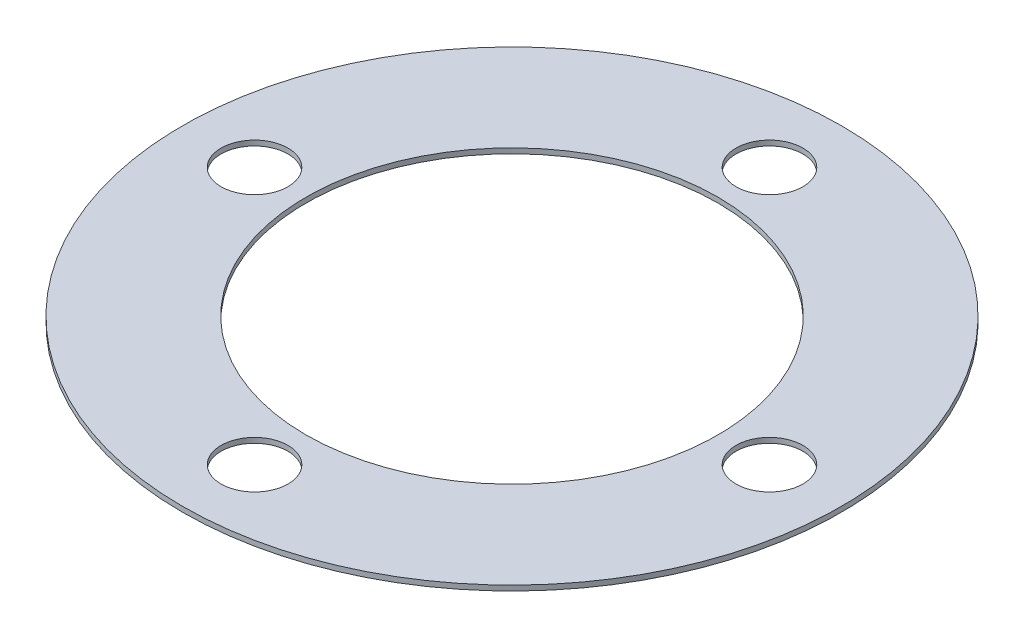
ISO-10303-21;
HEADER;
FILE_DESCRIPTION(('STEP AP214'),'2;1');
FILE_NAME('part.step','',(''),(''),'','','');
FILE_SCHEMA(('AUTOMOTIVE_DESIGN { 1 0 10303 214 1 1 1 1 }'));
ENDSEC;
DATA;
#1=APPLICATION_CONTEXT('core data for automotive mechanical design processes');
#2=APPLICATION_PROTOCOL_DEFINITION('international standard','automotive_design',2000,#1);
#3=PRODUCT_CONTEXT('',#1,'mechanical');
#4=PRODUCT('Part','Part','',(#3));
#5=PRODUCT_RELATED_PRODUCT_CATEGORY('part','',(#4));
#6=PRODUCT_DEFINITION_FORMATION('','',#4);
#7=PRODUCT_DEFINITION_CONTEXT('part definition',#1,'design');
#8=PRODUCT_DEFINITION('design','',#6,#7);
#9=PRODUCT_DEFINITION_SHAPE('','',#8);
#10=(LENGTH_UNIT() NAMED_UNIT(*) SI_UNIT(.MILLI.,.METRE.));
#11=(NAMED_UNIT(*) PLANE_ANGLE_UNIT() SI_UNIT($,.RADIAN.));
#12=(NAMED_UNIT(*) SI_UNIT($,.STERADIAN.) SOLID_ANGLE_UNIT());
#13=UNCERTAINTY_MEASURE_WITH_UNIT(LENGTH_MEASURE(1.E-05),#10,'distance_accuracy_value','');
#14=(GEOMETRIC_REPRESENTATION_CONTEXT(3) GLOBAL_UNCERTAINTY_ASSIGNED_CONTEXT((#13)) GLOBAL_UNIT_ASSIGNED_CONTEXT((#10,
#11,#12)) REPRESENTATION_CONTEXT('',''));
#15=CARTESIAN_POINT('',(0.,0.,0.));
#16=DIRECTION('',(0.,0.,1.));
#17=DIRECTION('',(1.,0.,0.));
#18=AXIS2_PLACEMENT_3D('',#15,#16,#17);
#19=CARTESIAN_POINT('',(0.,0.5,0.));
#20=DIRECTION('',(0.,1.,0.));
#21=DIRECTION('',(0.,0.,1.));
#22=AXIS2_PLACEMENT_3D('',#19,#20,#21);
#23=PLANE('',#22);
#24=CARTESIAN_POINT('',(2.8329860920468E-12,0.5,25.));
#25=DIRECTION('',(0.,1.,0.));
#26=DIRECTION('',(0.,0.,1.));
#27=AXIS2_PLACEMENT_3D('',#24,#25,#26);
#28=CIRCLE('',#27,3.25000000000288);
#29=CARTESIAN_POINT('',(2.8329860920468E-12,0.5,28.2500000000029));
#30=VERTEX_POINT('',#29);
#31=EDGE_CURVE('E59',#30,#30,#28,.T.);
#32=ORIENTED_EDGE('',*,*,#31,.F.);
#33=EDGE_LOOP('',(#32));
#34=FACE_BOUND('',#33,.T.);
#35=CARTESIAN_POINT('',(0.,0.5,-25.));
#36=DIRECTION('',(0.,1.,0.));
#37=DIRECTION('',(0.,0.,1.));
#38=AXIS2_PLACEMENT_3D('',#35,#36,#37);
#39=CIRCLE('',#38,3.25);
#40=CARTESIAN_POINT('',(0.,0.5,-21.75));
#41=VERTEX_POINT('',#40);
#42=EDGE_CURVE('E47',#41,#41,#39,.T.);
#43=ORIENTED_EDGE('',*,*,#42,.F.);
#44=EDGE_LOOP('',(#43));
#45=FACE_BOUND('',#44,.T.);
#46=CARTESIAN_POINT('',(0.,0.5,0.));
#47=DIRECTION('',(0.,1.,0.));
#48=DIRECTION('',(0.,0.,1.));
#49=AXIS2_PLACEMENT_3D('',#46,#47,#48);
#50=CIRCLE('',#49,32.);
#51=CARTESIAN_POINT('',(0.,0.5,32.));
#52=VERTEX_POINT('',#51);
#53=EDGE_CURVE('E10',#52,#52,#50,.T.);
#54=ORIENTED_EDGE('',*,*,#53,.T.);
#55=EDGE_LOOP('',(#54));
#56=FACE_BOUND('',#55,.T.);
#57=CARTESIAN_POINT('',(0.,0.5,0.));
#58=DIRECTION('',(0.,1.,0.));
#59=DIRECTION('',(0.,0.,1.));
#60=AXIS2_PLACEMENT_3D('',#57,#58,#59);
#61=CIRCLE('',#60,20.);
#62=CARTESIAN_POINT('',(0.,0.5,20.));
#63=VERTEX_POINT('',#62);
#64=EDGE_CURVE('E42',#63,#63,#61,.T.);
#65=ORIENTED_EDGE('',*,*,#64,.F.);
#66=EDGE_LOOP('',(#65));
#67=FACE_BOUND('',#66,.T.);
#68=CARTESIAN_POINT('',(25.0000000000014,0.5,-1.4164930460234E-12));
#69=DIRECTION('',(0.,1.,0.));
#70=DIRECTION('',(0.,0.,1.));
#71=AXIS2_PLACEMENT_3D('',#68,#69,#70);
#72=CIRCLE('',#71,3.25000000000102);
#73=CARTESIAN_POINT('',(25.0000000000014,0.5,3.24999999999961));
#74=VERTEX_POINT('',#73);
#75=EDGE_CURVE('E53',#74,#74,#72,.T.);
#76=ORIENTED_EDGE('',*,*,#75,.F.);
#77=EDGE_LOOP('',(#76));
#78=FACE_BOUND('',#77,.T.);
#79=CARTESIAN_POINT('',(-24.9999999999986,0.5,1.41955466302127E-12));
#80=DIRECTION('',(0.,1.,0.));
#81=DIRECTION('',(0.,0.,1.));
#82=AXIS2_PLACEMENT_3D('',#79,#80,#81);
#83=CIRCLE('',#82,3.25000000000202);
#84=CARTESIAN_POINT('',(-24.9999999999986,0.5,3.25000000000344));
#85=VERTEX_POINT('',#84);
#86=EDGE_CURVE('E65',#85,#85,#83,.T.);
#87=ORIENTED_EDGE('',*,*,#86,.F.);
#88=EDGE_LOOP('',(#87));
#89=FACE_BOUND('',#88,.T.);
#90=ADVANCED_FACE('F31',(#34,#45,#56,#67,#78,#89),#23,.T.);
#91=CARTESIAN_POINT('',(0.,0.,0.));
#92=DIRECTION('',(0.,1.,0.));
#93=DIRECTION('',(0.,0.,1.));
#94=AXIS2_PLACEMENT_3D('',#91,#92,#93);
#95=PLANE('',#94);
#96=CARTESIAN_POINT('',(0.,0.,0.));
#97=DIRECTION('',(0.,1.,0.));
#98=DIRECTION('',(0.,0.,1.));
#99=AXIS2_PLACEMENT_3D('',#96,#97,#98);
#100=CIRCLE('',#99,32.);
#101=CARTESIAN_POINT('',(0.,0.,32.));
#102=VERTEX_POINT('',#101);
#103=EDGE_CURVE('E35',#102,#102,#100,.T.);
#104=ORIENTED_EDGE('',*,*,#103,.F.);
#105=EDGE_LOOP('',(#104));
#106=FACE_BOUND('',#105,.T.);
#107=CARTESIAN_POINT('',(0.,0.,0.));
#108=DIRECTION('',(0.,1.,0.));
#109=DIRECTION('',(0.,0.,1.));
#110=AXIS2_PLACEMENT_3D('',#107,#108,#109);
#111=CIRCLE('',#110,20.);
#112=CARTESIAN_POINT('',(0.,0.,20.));
#113=VERTEX_POINT('',#112);
#114=EDGE_CURVE('E44',#113,#113,#111,.T.);
#115=ORIENTED_EDGE('',*,*,#114,.T.);
#116=EDGE_LOOP('',(#115));
#117=FACE_BOUND('',#116,.T.);
#118=CARTESIAN_POINT('',(0.,0.,-25.));
#119=DIRECTION('',(0.,1.,0.));
#120=DIRECTION('',(0.,0.,1.));
#121=AXIS2_PLACEMENT_3D('',#118,#119,#120);
#122=CIRCLE('',#121,3.25);
#123=CARTESIAN_POINT('',(0.,0.,-21.75));
#124=VERTEX_POINT('',#123);
#125=EDGE_CURVE('E50',#124,#124,#122,.T.);
#126=ORIENTED_EDGE('',*,*,#125,.T.);
#127=EDGE_LOOP('',(#126));
#128=FACE_BOUND('',#127,.T.);
#129=CARTESIAN_POINT('',(25.0000000000014,0.,-1.4164930460234E-12));
#130=DIRECTION('',(0.,1.,0.));
#131=DIRECTION('',(0.,0.,1.));
#132=AXIS2_PLACEMENT_3D('',#129,#130,#131);
#133=CIRCLE('',#132,3.25000000000102);
#134=CARTESIAN_POINT('',(25.0000000000014,0.,3.24999999999961));
#135=VERTEX_POINT('',#134);
#136=EDGE_CURVE('E56',#135,#135,#133,.T.);
#137=ORIENTED_EDGE('',*,*,#136,.T.);
#138=EDGE_LOOP('',(#137));
#139=FACE_BOUND('',#138,.T.);
#140=CARTESIAN_POINT('',(2.8329860920468E-12,0.,25.));
#141=DIRECTION('',(0.,1.,0.));
#142=DIRECTION('',(0.,0.,1.));
#143=AXIS2_PLACEMENT_3D('',#140,#141,#142);
#144=CIRCLE('',#143,3.25000000000288);
#145=CARTESIAN_POINT('',(2.8329860920468E-12,0.,28.2500000000029));
#146=VERTEX_POINT('',#145);
#147=EDGE_CURVE('E62',#146,#146,#144,.T.);
#148=ORIENTED_EDGE('',*,*,#147,.T.);
#149=EDGE_LOOP('',(#148));
#150=FACE_BOUND('',#149,.T.);
#151=CARTESIAN_POINT('',(-24.9999999999986,0.,1.41955466302127E-12));
#152=DIRECTION('',(0.,1.,0.));
#153=DIRECTION('',(0.,0.,1.));
#154=AXIS2_PLACEMENT_3D('',#151,#152,#153);
#155=CIRCLE('',#154,3.25000000000202);
#156=CARTESIAN_POINT('',(-24.9999999999986,0.,3.25000000000344));
#157=VERTEX_POINT('',#156);
#158=EDGE_CURVE('E68',#157,#157,#155,.T.);
#159=ORIENTED_EDGE('',*,*,#158,.T.);
#160=EDGE_LOOP('',(#159));
#161=FACE_BOUND('',#160,.T.);
#162=ADVANCED_FACE('F78',(#106,#117,#128,#139,#150,#161),#95,.F.);
#163=CARTESIAN_POINT('',(0.,0.5,0.));
#164=DIRECTION('',(0.,-1.,0.));
#165=DIRECTION('',(0.,0.,-1.));
#166=AXIS2_PLACEMENT_3D('',#163,#164,#165);
#167=CYLINDRICAL_SURFACE('',#166,32.);
#168=ORIENTED_EDGE('',*,*,#53,.F.);
#169=EDGE_LOOP('',(#168));
#170=FACE_BOUND('',#169,.T.);
#171=ORIENTED_EDGE('',*,*,#103,.T.);
#172=EDGE_LOOP('',(#171));
#173=FACE_BOUND('',#172,.T.);
#174=ADVANCED_FACE('F33',(#170,#173),#167,.T.);
#175=CARTESIAN_POINT('',(0.,0.5,0.));
#176=DIRECTION('',(0.,-1.,0.));
#177=DIRECTION('',(0.,0.,-1.));
#178=AXIS2_PLACEMENT_3D('',#175,#176,#177);
#179=CYLINDRICAL_SURFACE('',#178,20.);
#180=ORIENTED_EDGE('',*,*,#64,.T.);
#181=EDGE_LOOP('',(#180));
#182=FACE_BOUND('',#181,.T.);
#183=ORIENTED_EDGE('',*,*,#114,.F.);
#184=EDGE_LOOP('',(#183));
#185=FACE_BOUND('',#184,.T.);
#186=ADVANCED_FACE('F88',(#182,#185),#179,.F.);
#187=CARTESIAN_POINT('',(0.,0.5,-25.));
#188=DIRECTION('',(0.,-1.,0.));
#189=DIRECTION('',(0.,0.,-1.));
#190=AXIS2_PLACEMENT_3D('',#187,#188,#189);
#191=CYLINDRICAL_SURFACE('',#190,3.25);
#192=ORIENTED_EDGE('',*,*,#42,.T.);
#193=EDGE_LOOP('',(#192));
#194=FACE_BOUND('',#193,.T.);
#195=ORIENTED_EDGE('',*,*,#125,.F.);
#196=EDGE_LOOP('',(#195));
#197=FACE_BOUND('',#196,.T.);
#198=ADVANCED_FACE('F91',(#194,#197),#191,.F.);
#199=CARTESIAN_POINT('',(25.0000000000014,0.5,-1.4164930460234E-12));
#200=DIRECTION('',(0.,-1.,0.));
#201=DIRECTION('',(0.,0.,-1.));
#202=AXIS2_PLACEMENT_3D('',#199,#200,#201);
#203=CYLINDRICAL_SURFACE('',#202,3.25000000000102);
#204=ORIENTED_EDGE('',*,*,#75,.T.);
#205=EDGE_LOOP('',(#204));
#206=FACE_BOUND('',#205,.T.);
#207=ORIENTED_EDGE('',*,*,#136,.F.);
#208=EDGE_LOOP('',(#207));
#209=FACE_BOUND('',#208,.T.);
#210=ADVANCED_FACE('F95',(#206,#209),#203,.F.);
#211=CARTESIAN_POINT('',(2.8329860920468E-12,0.5,25.));
#212=DIRECTION('',(0.,-1.,0.));
#213=DIRECTION('',(0.,0.,-1.));
#214=AXIS2_PLACEMENT_3D('',#211,#212,#213);
#215=CYLINDRICAL_SURFACE('',#214,3.25000000000288);
#216=ORIENTED_EDGE('',*,*,#31,.T.);
#217=EDGE_LOOP('',(#216));
#218=FACE_BOUND('',#217,.T.);
#219=ORIENTED_EDGE('',*,*,#147,.F.);
#220=EDGE_LOOP('',(#219));
#221=FACE_BOUND('',#220,.T.);
#222=ADVANCED_FACE('F99',(#218,#221),#215,.F.);
#223=CARTESIAN_POINT('',(-24.9999999999986,0.5,1.41955466302127E-12));
#224=DIRECTION('',(0.,-1.,0.));
#225=DIRECTION('',(0.,0.,-1.));
#226=AXIS2_PLACEMENT_3D('',#223,#224,#225);
#227=CYLINDRICAL_SURFACE('',#226,3.25000000000202);
#228=ORIENTED_EDGE('',*,*,#86,.T.);
#229=EDGE_LOOP('',(#228));
#230=FACE_BOUND('',#229,.T.);
#231=ORIENTED_EDGE('',*,*,#158,.F.);
#232=EDGE_LOOP('',(#231));
#233=FACE_BOUND('',#232,.T.);
#234=ADVANCED_FACE('F74',(#230,#233),#227,.F.);
#235=CLOSED_SHELL('',(#90,#162,#174,#186,#198,#210,#222,#234));
#236=MANIFOLD_SOLID_BREP('B2',#235);
#237=ADVANCED_BREP_SHAPE_REPRESENTATION('',(#18,#236),#14);
#238=SHAPE_DEFINITION_REPRESENTATION(#9,#237);
ENDSEC;
END-ISO-10303-21;
